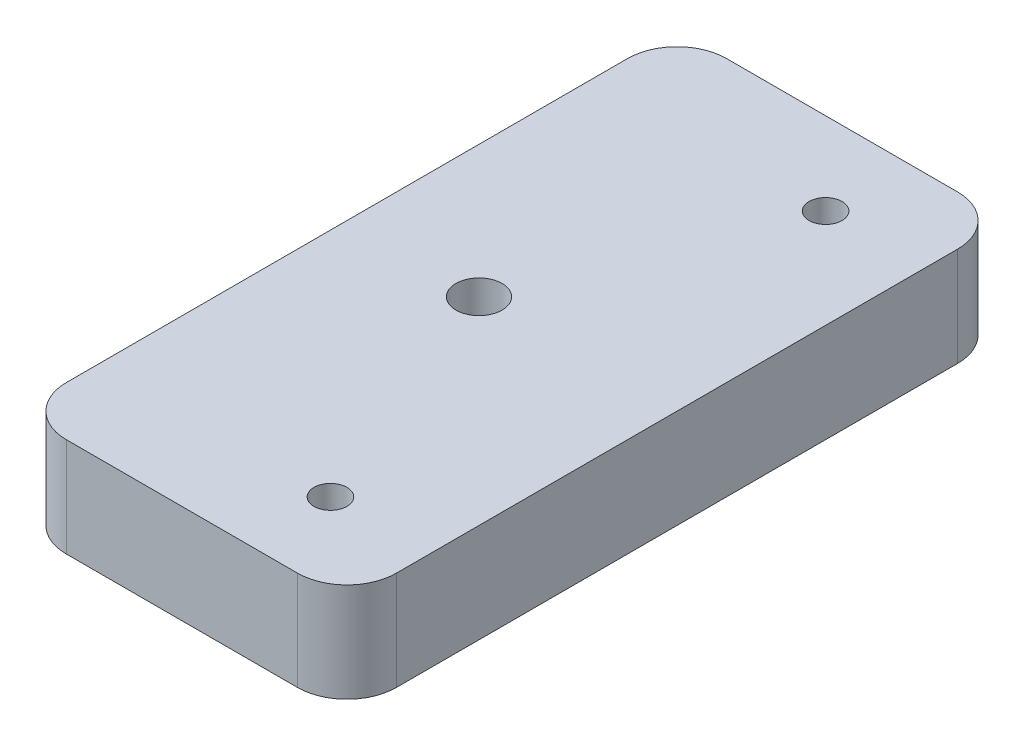
ISO-10303-21;
HEADER;
FILE_DESCRIPTION(('STEP AP214'),'2;1');
FILE_NAME('part.step','',(''),(''),'','','');
FILE_SCHEMA(('AUTOMOTIVE_DESIGN { 1 0 10303 214 1 1 1 1 }'));
ENDSEC;
DATA;
#1=APPLICATION_CONTEXT('core data for automotive mechanical design processes');
#2=APPLICATION_PROTOCOL_DEFINITION('international standard','automotive_design',2000,#1);
#3=PRODUCT_CONTEXT('',#1,'mechanical');
#4=PRODUCT('Part','Part','',(#3));
#5=PRODUCT_RELATED_PRODUCT_CATEGORY('part','',(#4));
#6=PRODUCT_DEFINITION_FORMATION('','',#4);
#7=PRODUCT_DEFINITION_CONTEXT('part definition',#1,'design');
#8=PRODUCT_DEFINITION('design','',#6,#7);
#9=PRODUCT_DEFINITION_SHAPE('','',#8);
#10=(LENGTH_UNIT() NAMED_UNIT(*) SI_UNIT(.MILLI.,.METRE.));
#11=(NAMED_UNIT(*) PLANE_ANGLE_UNIT() SI_UNIT($,.RADIAN.));
#12=(NAMED_UNIT(*) SI_UNIT($,.STERADIAN.) SOLID_ANGLE_UNIT());
#13=UNCERTAINTY_MEASURE_WITH_UNIT(LENGTH_MEASURE(1.E-05),#10,'distance_accuracy_value','');
#14=(GEOMETRIC_REPRESENTATION_CONTEXT(3) GLOBAL_UNCERTAINTY_ASSIGNED_CONTEXT((#13)) GLOBAL_UNIT_ASSIGNED_CONTEXT((#10,
#11,#12)) REPRESENTATION_CONTEXT('',''));
#15=CARTESIAN_POINT('',(0.,0.,0.));
#16=DIRECTION('',(0.,0.,1.));
#17=DIRECTION('',(1.,0.,0.));
#18=AXIS2_PLACEMENT_3D('',#15,#16,#17);
#19=CARTESIAN_POINT('',(15.746425484691,30.,-1.73824130879346));
#20=DIRECTION('',(0.,1.,0.));
#21=DIRECTION('',(1.,0.,0.));
#22=AXIS2_PLACEMENT_3D('',#19,#20,#21);
#23=PLANE('',#22);
#24=CARTESIAN_POINT('',(5.74642548469095,30.,-1.73824130879343));
#25=DIRECTION('',(0.,-1.,0.));
#26=DIRECTION('',(-1.,0.,0.));
#27=AXIS2_PLACEMENT_3D('',#24,#25,#26);
#28=CIRCLE('',#27,7.);
#29=CARTESIAN_POINT('',(12.7464254846909,30.,-1.73824130879343));
#30=VERTEX_POINT('',#29);
#31=EDGE_CURVE('E165',#30,#30,#28,.T.);
#32=ORIENTED_EDGE('',*,*,#31,.T.);
#33=EDGE_LOOP('',(#32));
#34=FACE_BOUND('',#33,.T.);
#35=CARTESIAN_POINT('',(35.746425484691,30.,73.2617586912066));
#36=DIRECTION('',(0.,-1.,0.));
#37=DIRECTION('',(-1.,0.,0.));
#38=AXIS2_PLACEMENT_3D('',#35,#36,#37);
#39=CIRCLE('',#38,5.);
#40=CARTESIAN_POINT('',(40.746425484691,30.,73.2617586912066));
#41=VERTEX_POINT('',#40);
#42=EDGE_CURVE('E166',#41,#41,#39,.T.);
#43=ORIENTED_EDGE('',*,*,#42,.T.);
#44=EDGE_LOOP('',(#43));
#45=FACE_BOUND('',#44,.T.);
#46=CARTESIAN_POINT('',(35.746425484691,30.,-76.7382413087934));
#47=DIRECTION('',(0.,-1.,0.));
#48=DIRECTION('',(-1.,0.,0.));
#49=AXIS2_PLACEMENT_3D('',#46,#47,#48);
#50=CIRCLE('',#49,5.);
#51=CARTESIAN_POINT('',(40.746425484691,30.,-76.7382413087934));
#52=VERTEX_POINT('',#51);
#53=EDGE_CURVE('E180',#52,#52,#50,.T.);
#54=ORIENTED_EDGE('',*,*,#53,.T.);
#55=EDGE_LOOP('',(#54));
#56=FACE_BOUND('',#55,.T.);
#57=CARTESIAN_POINT('',(-19.253574515309,30.,83.2617586912066));
#58=DIRECTION('',(0.,-1.,0.));
#59=DIRECTION('',(-0.707106781186548,0.,0.707106781186548));
#60=AXIS2_PLACEMENT_3D('',#57,#58,#59);
#61=CIRCLE('',#60,15.);
#62=CARTESIAN_POINT('',(-19.253574515309,30.,98.2617586912066));
#63=VERTEX_POINT('',#62);
#64=CARTESIAN_POINT('',(-34.253574515309,30.,83.2617586912066));
#65=VERTEX_POINT('',#64);
#66=EDGE_CURVE('E151',#63,#65,#61,.T.);
#67=ORIENTED_EDGE('',*,*,#66,.F.);
#68=DIRECTION('',(1.,0.,0.));
#69=VECTOR('',#68,1.);
#70=CARTESIAN_POINT('',(-34.253574515309,30.,98.2617586912066));
#71=LINE('',#70,#69);
#72=CARTESIAN_POINT('',(50.746425484691,30.,98.2617586912065));
#73=VERTEX_POINT('',#72);
#74=EDGE_CURVE('E11',#63,#73,#71,.T.);
#75=ORIENTED_EDGE('',*,*,#74,.T.);
#76=CARTESIAN_POINT('',(50.746425484691,30.,83.2617586912065));
#77=DIRECTION('',(0.,-1.,0.));
#78=DIRECTION('',(0.707106781186548,0.,0.707106781186548));
#79=AXIS2_PLACEMENT_3D('',#76,#77,#78);
#80=CIRCLE('',#79,15.);
#81=CARTESIAN_POINT('',(65.746425484691,30.,83.2617586912065));
#82=VERTEX_POINT('',#81);
#83=EDGE_CURVE('E204',#82,#73,#80,.T.);
#84=ORIENTED_EDGE('',*,*,#83,.F.);
#85=DIRECTION('',(0.,0.,-1.));
#86=VECTOR('',#85,1.);
#87=CARTESIAN_POINT('',(65.746425484691,30.,98.2617586912065));
#88=LINE('',#87,#86);
#89=CARTESIAN_POINT('',(65.746425484691,30.,-86.7382413087935));
#90=VERTEX_POINT('',#89);
#91=EDGE_CURVE('E200',#82,#90,#88,.T.);
#92=ORIENTED_EDGE('',*,*,#91,.T.);
#93=CARTESIAN_POINT('',(50.746425484691,30.,-86.7382413087935));
#94=DIRECTION('',(0.,-1.,0.));
#95=DIRECTION('',(0.707106781186548,0.,-0.707106781186548));
#96=AXIS2_PLACEMENT_3D('',#93,#94,#95);
#97=CIRCLE('',#96,15.);
#98=CARTESIAN_POINT('',(50.746425484691,30.,-101.738241308793));
#99=VERTEX_POINT('',#98);
#100=EDGE_CURVE('E196',#99,#90,#97,.T.);
#101=ORIENTED_EDGE('',*,*,#100,.F.);
#102=DIRECTION('',(-1.,0.,0.));
#103=VECTOR('',#102,1.);
#104=CARTESIAN_POINT('',(65.746425484691,30.,-101.738241308793));
#105=LINE('',#104,#103);
#106=CARTESIAN_POINT('',(-19.2535745153091,30.,-101.738241308793));
#107=VERTEX_POINT('',#106);
#108=EDGE_CURVE('E27',#99,#107,#105,.T.);
#109=ORIENTED_EDGE('',*,*,#108,.T.);
#110=CARTESIAN_POINT('',(-19.2535745153091,30.,-86.7382413087934));
#111=DIRECTION('',(0.,-1.,0.));
#112=DIRECTION('',(-0.707106781186548,0.,-0.707106781186547));
#113=AXIS2_PLACEMENT_3D('',#110,#111,#112);
#114=CIRCLE('',#113,15.);
#115=CARTESIAN_POINT('',(-34.2535745153091,30.,-86.7382413087934));
#116=VERTEX_POINT('',#115);
#117=EDGE_CURVE('E215',#116,#107,#114,.T.);
#118=ORIENTED_EDGE('',*,*,#117,.F.);
#119=DIRECTION('',(0.,0.,1.));
#120=VECTOR('',#119,1.);
#121=CARTESIAN_POINT('',(-34.2535745153091,30.,-101.738241308793));
#122=LINE('',#121,#120);
#123=EDGE_CURVE('E211',#116,#65,#122,.T.);
#124=ORIENTED_EDGE('',*,*,#123,.T.);
#125=EDGE_LOOP('',(#67,#75,#84,#92,#101,#109,#118,#124));
#126=FACE_BOUND('',#125,.T.);
#127=ADVANCED_FACE('F17',(#34,#45,#56,#126),#23,.T.);
#128=CARTESIAN_POINT('',(-34.253574515309,0.,98.2617586912066));
#129=DIRECTION('',(0.,0.,1.));
#130=DIRECTION('',(1.,0.,0.));
#131=AXIS2_PLACEMENT_3D('',#128,#129,#130);
#132=PLANE('',#131);
#133=DIRECTION('',(0.,1.,0.));
#134=VECTOR('',#133,1.);
#135=CARTESIAN_POINT('',(-19.253574515309,0.,98.2617586912066));
#136=LINE('',#135,#134);
#137=CARTESIAN_POINT('',(-19.253574515309,0.,98.2617586912066));
#138=VERTEX_POINT('',#137);
#139=EDGE_CURVE('E137',#138,#63,#136,.T.);
#140=ORIENTED_EDGE('',*,*,#139,.F.);
#141=DIRECTION('',(1.,0.,0.));
#142=VECTOR('',#141,1.);
#143=CARTESIAN_POINT('',(-34.253574515309,0.,98.2617586912066));
#144=LINE('',#143,#142);
#145=CARTESIAN_POINT('',(50.746425484691,0.,98.2617586912065));
#146=VERTEX_POINT('',#145);
#147=EDGE_CURVE('E20',#138,#146,#144,.T.);
#148=ORIENTED_EDGE('',*,*,#147,.T.);
#149=DIRECTION('',(0.,-1.,0.));
#150=VECTOR('',#149,1.);
#151=CARTESIAN_POINT('',(50.746425484691,0.,98.2617586912065));
#152=LINE('',#151,#150);
#153=EDGE_CURVE('E173',#73,#146,#152,.T.);
#154=ORIENTED_EDGE('',*,*,#153,.F.);
#155=ORIENTED_EDGE('',*,*,#74,.F.);
#156=EDGE_LOOP('',(#140,#148,#154,#155));
#157=FACE_BOUND('',#156,.T.);
#158=ADVANCED_FACE('F283',(#157),#132,.T.);
#159=CARTESIAN_POINT('',(65.746425484691,0.,-101.738241308793));
#160=DIRECTION('',(0.,0.,-1.));
#161=DIRECTION('',(-1.,0.,0.));
#162=AXIS2_PLACEMENT_3D('',#159,#160,#161);
#163=PLANE('',#162);
#164=DIRECTION('',(0.,-1.,0.));
#165=VECTOR('',#164,1.);
#166=CARTESIAN_POINT('',(-19.2535745153091,0.,-101.738241308793));
#167=LINE('',#166,#165);
#168=CARTESIAN_POINT('',(-19.2535745153091,0.,-101.738241308793));
#169=VERTEX_POINT('',#168);
#170=EDGE_CURVE('E208',#107,#169,#167,.T.);
#171=ORIENTED_EDGE('',*,*,#170,.F.);
#172=ORIENTED_EDGE('',*,*,#108,.F.);
#173=DIRECTION('',(0.,1.,0.));
#174=VECTOR('',#173,1.);
#175=CARTESIAN_POINT('',(50.746425484691,0.,-101.738241308793));
#176=LINE('',#175,#174);
#177=CARTESIAN_POINT('',(50.746425484691,0.,-101.738241308793));
#178=VERTEX_POINT('',#177);
#179=EDGE_CURVE('E185',#178,#99,#176,.T.);
#180=ORIENTED_EDGE('',*,*,#179,.F.);
#181=DIRECTION('',(-1.,0.,0.));
#182=VECTOR('',#181,1.);
#183=CARTESIAN_POINT('',(65.746425484691,0.,-101.738241308793));
#184=LINE('',#183,#182);
#185=EDGE_CURVE('E203',#178,#169,#184,.T.);
#186=ORIENTED_EDGE('',*,*,#185,.T.);
#187=EDGE_LOOP('',(#171,#172,#180,#186));
#188=FACE_BOUND('',#187,.T.);
#189=ADVANCED_FACE('F265',(#188),#163,.T.);
#190=CARTESIAN_POINT('',(5.74642548469095,30.,-1.73824130879343));
#191=DIRECTION('',(0.,-1.,0.));
#192=DIRECTION('',(-1.,0.,0.));
#193=AXIS2_PLACEMENT_3D('',#190,#191,#192);
#194=CYLINDRICAL_SURFACE('',#193,7.);
#195=ORIENTED_EDGE('',*,*,#31,.F.);
#196=DIRECTION('',(0.,-1.,0.));
#197=VECTOR('',#196,1.);
#198=CARTESIAN_POINT('',(12.7464254846909,30.,-1.73824130879343));
#199=LINE('',#198,#197);
#200=CARTESIAN_POINT('',(12.7464254846909,0.,-1.73824130879343));
#201=VERTEX_POINT('',#200);
#202=EDGE_CURVE('E40',#30,#201,#199,.T.);
#203=ORIENTED_EDGE('',*,*,#202,.T.);
#204=CARTESIAN_POINT('',(5.74642548469095,0.,-1.73824130879343));
#205=DIRECTION('',(0.,1.,0.));
#206=DIRECTION('',(-1.,0.,0.));
#207=AXIS2_PLACEMENT_3D('',#204,#205,#206);
#208=CIRCLE('',#207,7.);
#209=EDGE_CURVE('E178',#201,#201,#208,.T.);
#210=ORIENTED_EDGE('',*,*,#209,.F.);
#211=ORIENTED_EDGE('',*,*,#202,.F.);
#212=EDGE_LOOP('',(#195,#203,#210,#211));
#213=FACE_BOUND('',#212,.T.);
#214=ADVANCED_FACE('F222',(#213),#194,.F.);
#215=CARTESIAN_POINT('',(35.746425484691,30.,73.2617586912066));
#216=DIRECTION('',(0.,-1.,0.));
#217=DIRECTION('',(-1.,0.,0.));
#218=AXIS2_PLACEMENT_3D('',#215,#216,#217);
#219=CYLINDRICAL_SURFACE('',#218,5.);
#220=ORIENTED_EDGE('',*,*,#42,.F.);
#221=DIRECTION('',(0.,-1.,0.));
#222=VECTOR('',#221,1.);
#223=CARTESIAN_POINT('',(40.746425484691,30.,73.2617586912066));
#224=LINE('',#223,#222);
#225=CARTESIAN_POINT('',(40.746425484691,0.,73.2617586912066));
#226=VERTEX_POINT('',#225);
#227=EDGE_CURVE('E163',#41,#226,#224,.T.);
#228=ORIENTED_EDGE('',*,*,#227,.T.);
#229=CARTESIAN_POINT('',(35.746425484691,0.,73.2617586912066));
#230=DIRECTION('',(0.,1.,0.));
#231=DIRECTION('',(-1.,0.,0.));
#232=AXIS2_PLACEMENT_3D('',#229,#230,#231);
#233=CIRCLE('',#232,5.);
#234=EDGE_CURVE('E174',#226,#226,#233,.T.);
#235=ORIENTED_EDGE('',*,*,#234,.F.);
#236=ORIENTED_EDGE('',*,*,#227,.F.);
#237=EDGE_LOOP('',(#220,#228,#235,#236));
#238=FACE_BOUND('',#237,.T.);
#239=ADVANCED_FACE('F307',(#238),#219,.F.);
#240=CARTESIAN_POINT('',(35.746425484691,30.,-76.7382413087934));
#241=DIRECTION('',(0.,-1.,0.));
#242=DIRECTION('',(-1.,0.,0.));
#243=AXIS2_PLACEMENT_3D('',#240,#241,#242);
#244=CYLINDRICAL_SURFACE('',#243,5.);
#245=ORIENTED_EDGE('',*,*,#53,.F.);
#246=DIRECTION('',(0.,-1.,0.));
#247=VECTOR('',#246,1.);
#248=CARTESIAN_POINT('',(40.746425484691,30.,-76.7382413087934));
#249=LINE('',#248,#247);
#250=CARTESIAN_POINT('',(40.746425484691,0.,-76.7382413087934));
#251=VERTEX_POINT('',#250);
#252=EDGE_CURVE('E184',#52,#251,#249,.T.);
#253=ORIENTED_EDGE('',*,*,#252,.T.);
#254=CARTESIAN_POINT('',(35.746425484691,0.,-76.7382413087934));
#255=DIRECTION('',(0.,1.,0.));
#256=DIRECTION('',(-1.,0.,0.));
#257=AXIS2_PLACEMENT_3D('',#254,#255,#256);
#258=CIRCLE('',#257,5.);
#259=EDGE_CURVE('E179',#251,#251,#258,.T.);
#260=ORIENTED_EDGE('',*,*,#259,.F.);
#261=ORIENTED_EDGE('',*,*,#252,.F.);
#262=EDGE_LOOP('',(#245,#253,#260,#261));
#263=FACE_BOUND('',#262,.T.);
#264=ADVANCED_FACE('F280',(#263),#244,.F.);
#265=CARTESIAN_POINT('',(50.746425484691,0.,-86.7382413087935));
#266=DIRECTION('',(0.,1.,0.));
#267=DIRECTION('',(0.707106781186548,0.,-0.707106781186548));
#268=AXIS2_PLACEMENT_3D('',#265,#266,#267);
#269=CYLINDRICAL_SURFACE('',#268,15.);
#270=ORIENTED_EDGE('',*,*,#100,.T.);
#271=DIRECTION('',(0.,-1.,0.));
#272=VECTOR('',#271,1.);
#273=CARTESIAN_POINT('',(65.746425484691,0.,-86.7382413087935));
#274=LINE('',#273,#272);
#275=CARTESIAN_POINT('',(65.746425484691,0.,-86.7382413087935));
#276=VERTEX_POINT('',#275);
#277=EDGE_CURVE('E172',#90,#276,#274,.T.);
#278=ORIENTED_EDGE('',*,*,#277,.T.);
#279=CARTESIAN_POINT('',(50.746425484691,0.,-86.7382413087935));
#280=DIRECTION('',(0.,1.,0.));
#281=DIRECTION('',(0.707106781186548,0.,-0.707106781186548));
#282=AXIS2_PLACEMENT_3D('',#279,#280,#281);
#283=CIRCLE('',#282,15.);
#284=EDGE_CURVE('E161',#276,#178,#283,.T.);
#285=ORIENTED_EDGE('',*,*,#284,.T.);
#286=ORIENTED_EDGE('',*,*,#179,.T.);
#287=EDGE_LOOP('',(#270,#278,#285,#286));
#288=FACE_BOUND('',#287,.T.);
#289=ADVANCED_FACE('F261',(#288),#269,.T.);
#290=CARTESIAN_POINT('',(65.746425484691,0.,98.2617586912065));
#291=DIRECTION('',(1.,0.,0.));
#292=DIRECTION('',(0.,1.,0.));
#293=AXIS2_PLACEMENT_3D('',#290,#291,#292);
#294=PLANE('',#293);
#295=DIRECTION('',(0.,1.,0.));
#296=VECTOR('',#295,1.);
#297=CARTESIAN_POINT('',(65.746425484691,0.,83.2617586912065));
#298=LINE('',#297,#296);
#299=CARTESIAN_POINT('',(65.746425484691,0.,83.2617586912065));
#300=VERTEX_POINT('',#299);
#301=EDGE_CURVE('E168',#300,#82,#298,.T.);
#302=ORIENTED_EDGE('',*,*,#301,.F.);
#303=DIRECTION('',(0.,0.,-1.));
#304=VECTOR('',#303,1.);
#305=CARTESIAN_POINT('',(65.746425484691,0.,98.2617586912065));
#306=LINE('',#305,#304);
#307=EDGE_CURVE('E242',#300,#276,#306,.T.);
#308=ORIENTED_EDGE('',*,*,#307,.T.);
#309=ORIENTED_EDGE('',*,*,#277,.F.);
#310=ORIENTED_EDGE('',*,*,#91,.F.);
#311=EDGE_LOOP('',(#302,#308,#309,#310));
#312=FACE_BOUND('',#311,.T.);
#313=ADVANCED_FACE('F268',(#312),#294,.T.);
#314=CARTESIAN_POINT('',(50.746425484691,0.,83.2617586912065));
#315=DIRECTION('',(0.,1.,0.));
#316=DIRECTION('',(0.707106781186548,0.,0.707106781186548));
#317=AXIS2_PLACEMENT_3D('',#314,#315,#316);
#318=CYLINDRICAL_SURFACE('',#317,15.);
#319=ORIENTED_EDGE('',*,*,#83,.T.);
#320=ORIENTED_EDGE('',*,*,#153,.T.);
#321=CARTESIAN_POINT('',(50.746425484691,0.,83.2617586912065));
#322=DIRECTION('',(0.,1.,0.));
#323=DIRECTION('',(0.707106781186548,0.,0.707106781186548));
#324=AXIS2_PLACEMENT_3D('',#321,#322,#323);
#325=CIRCLE('',#324,15.);
#326=EDGE_CURVE('E245',#146,#300,#325,.T.);
#327=ORIENTED_EDGE('',*,*,#326,.T.);
#328=ORIENTED_EDGE('',*,*,#301,.T.);
#329=EDGE_LOOP('',(#319,#320,#327,#328));
#330=FACE_BOUND('',#329,.T.);
#331=ADVANCED_FACE('F270',(#330),#318,.T.);
#332=CARTESIAN_POINT('',(-19.2535745153091,0.,-86.7382413087934));
#333=DIRECTION('',(0.,1.,0.));
#334=DIRECTION('',(-0.707106781186548,0.,-0.707106781186547));
#335=AXIS2_PLACEMENT_3D('',#332,#333,#334);
#336=CYLINDRICAL_SURFACE('',#335,15.);
#337=ORIENTED_EDGE('',*,*,#117,.T.);
#338=ORIENTED_EDGE('',*,*,#170,.T.);
#339=CARTESIAN_POINT('',(-19.2535745153091,0.,-86.7382413087934));
#340=DIRECTION('',(0.,1.,0.));
#341=DIRECTION('',(-0.707106781186548,0.,-0.707106781186547));
#342=AXIS2_PLACEMENT_3D('',#339,#340,#341);
#343=CIRCLE('',#342,15.);
#344=CARTESIAN_POINT('',(-34.2535745153091,0.,-86.7382413087934));
#345=VERTEX_POINT('',#344);
#346=EDGE_CURVE('E136',#169,#345,#343,.T.);
#347=ORIENTED_EDGE('',*,*,#346,.T.);
#348=DIRECTION('',(0.,1.,0.));
#349=VECTOR('',#348,1.);
#350=CARTESIAN_POINT('',(-34.2535745153091,0.,-86.7382413087934));
#351=LINE('',#350,#349);
#352=EDGE_CURVE('E131',#345,#116,#351,.T.);
#353=ORIENTED_EDGE('',*,*,#352,.T.);
#354=EDGE_LOOP('',(#337,#338,#347,#353));
#355=FACE_BOUND('',#354,.T.);
#356=ADVANCED_FACE('F277',(#355),#336,.T.);
#357=CARTESIAN_POINT('',(-34.2535745153091,0.,-101.738241308793));
#358=DIRECTION('',(-1.,0.,0.));
#359=DIRECTION('',(0.,1.,0.));
#360=AXIS2_PLACEMENT_3D('',#357,#358,#359);
#361=PLANE('',#360);
#362=DIRECTION('',(0.,-1.,0.));
#363=VECTOR('',#362,1.);
#364=CARTESIAN_POINT('',(-34.253574515309,0.,83.2617586912066));
#365=LINE('',#364,#363);
#366=CARTESIAN_POINT('',(-34.253574515309,0.,83.2617586912066));
#367=VERTEX_POINT('',#366);
#368=EDGE_CURVE('E128',#65,#367,#365,.T.);
#369=ORIENTED_EDGE('',*,*,#368,.F.);
#370=ORIENTED_EDGE('',*,*,#123,.F.);
#371=ORIENTED_EDGE('',*,*,#352,.F.);
#372=DIRECTION('',(0.,0.,1.));
#373=VECTOR('',#372,1.);
#374=CARTESIAN_POINT('',(-34.2535745153091,0.,-101.738241308793));
#375=LINE('',#374,#373);
#376=EDGE_CURVE('E123',#345,#367,#375,.T.);
#377=ORIENTED_EDGE('',*,*,#376,.T.);
#378=EDGE_LOOP('',(#369,#370,#371,#377));
#379=FACE_BOUND('',#378,.T.);
#380=ADVANCED_FACE('F125',(#379),#361,.T.);
#381=CARTESIAN_POINT('',(15.746425484691,0.,-1.73824130879346));
#382=DIRECTION('',(0.,1.,0.));
#383=DIRECTION('',(1.,0.,0.));
#384=AXIS2_PLACEMENT_3D('',#381,#382,#383);
#385=PLANE('',#384);
#386=ORIENTED_EDGE('',*,*,#209,.T.);
#387=EDGE_LOOP('',(#386));
#388=FACE_BOUND('',#387,.T.);
#389=ORIENTED_EDGE('',*,*,#234,.T.);
#390=EDGE_LOOP('',(#389));
#391=FACE_BOUND('',#390,.T.);
#392=ORIENTED_EDGE('',*,*,#259,.T.);
#393=EDGE_LOOP('',(#392));
#394=FACE_BOUND('',#393,.T.);
#395=CARTESIAN_POINT('',(-19.253574515309,0.,83.2617586912066));
#396=DIRECTION('',(0.,1.,0.));
#397=DIRECTION('',(-0.707106781186548,0.,0.707106781186548));
#398=AXIS2_PLACEMENT_3D('',#395,#396,#397);
#399=CIRCLE('',#398,15.);
#400=EDGE_CURVE('E140',#367,#138,#399,.T.);
#401=ORIENTED_EDGE('',*,*,#400,.F.);
#402=ORIENTED_EDGE('',*,*,#376,.F.);
#403=ORIENTED_EDGE('',*,*,#346,.F.);
#404=ORIENTED_EDGE('',*,*,#185,.F.);
#405=ORIENTED_EDGE('',*,*,#284,.F.);
#406=ORIENTED_EDGE('',*,*,#307,.F.);
#407=ORIENTED_EDGE('',*,*,#326,.F.);
#408=ORIENTED_EDGE('',*,*,#147,.F.);
#409=EDGE_LOOP('',(#401,#402,#403,#404,#405,#406,#407,#408));
#410=FACE_BOUND('',#409,.T.);
#411=ADVANCED_FACE('F141',(#388,#391,#394,#410),#385,.F.);
#412=CARTESIAN_POINT('',(-19.253574515309,0.,83.2617586912066));
#413=DIRECTION('',(0.,1.,0.));
#414=DIRECTION('',(-0.707106781186548,0.,0.707106781186548));
#415=AXIS2_PLACEMENT_3D('',#412,#413,#414);
#416=CYLINDRICAL_SURFACE('',#415,15.);
#417=ORIENTED_EDGE('',*,*,#66,.T.);
#418=ORIENTED_EDGE('',*,*,#368,.T.);
#419=ORIENTED_EDGE('',*,*,#400,.T.);
#420=ORIENTED_EDGE('',*,*,#139,.T.);
#421=EDGE_LOOP('',(#417,#418,#419,#420));
#422=FACE_BOUND('',#421,.T.);
#423=ADVANCED_FACE('F149',(#422),#416,.T.);
#424=CLOSED_SHELL('',(#127,#158,#189,#214,#239,#264,#289,#313,#331,#356,#380,#411,#423));
#425=MANIFOLD_SOLID_BREP('B1',#424);
#426=ADVANCED_BREP_SHAPE_REPRESENTATION('',(#18,#425),#14);
#427=SHAPE_DEFINITION_REPRESENTATION(#9,#426);
ENDSEC;
END-ISO-10303-21;
